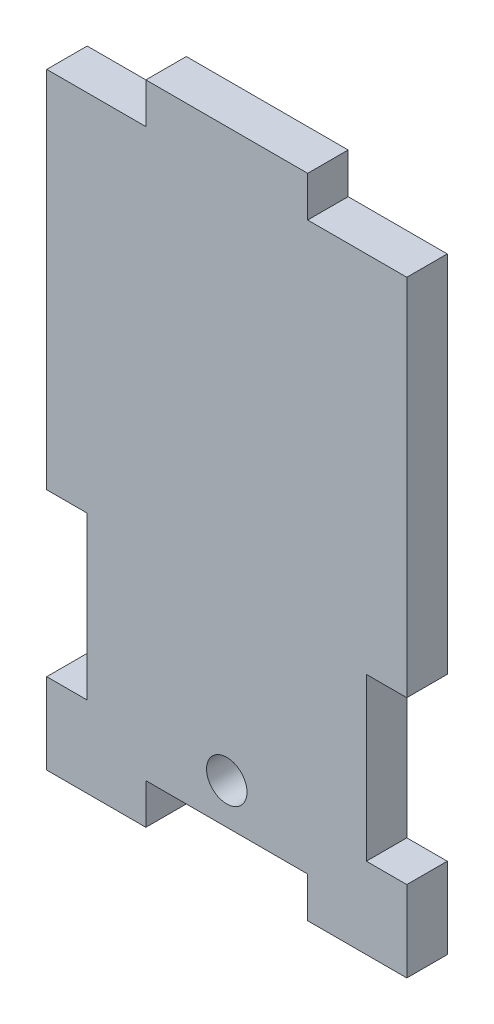
ISO-10303-21;
HEADER;
FILE_DESCRIPTION(('STEP AP214'),'2;1');
FILE_NAME('part.step','',(''),(''),'','','');
FILE_SCHEMA(('AUTOMOTIVE_DESIGN { 1 0 10303 214 1 1 1 1 }'));
ENDSEC;
DATA;
#1=APPLICATION_CONTEXT('core data for automotive mechanical design processes');
#2=APPLICATION_PROTOCOL_DEFINITION('international standard','automotive_design',2000,#1);
#3=PRODUCT_CONTEXT('',#1,'mechanical');
#4=PRODUCT('Part','Part','',(#3));
#5=PRODUCT_RELATED_PRODUCT_CATEGORY('part','',(#4));
#6=PRODUCT_DEFINITION_FORMATION('','',#4);
#7=PRODUCT_DEFINITION_CONTEXT('part definition',#1,'design');
#8=PRODUCT_DEFINITION('design','',#6,#7);
#9=PRODUCT_DEFINITION_SHAPE('','',#8);
#10=(LENGTH_UNIT() NAMED_UNIT(*) SI_UNIT(.MILLI.,.METRE.));
#11=(NAMED_UNIT(*) PLANE_ANGLE_UNIT() SI_UNIT($,.RADIAN.));
#12=(NAMED_UNIT(*) SI_UNIT($,.STERADIAN.) SOLID_ANGLE_UNIT());
#13=UNCERTAINTY_MEASURE_WITH_UNIT(LENGTH_MEASURE(1.E-05),#10,'distance_accuracy_value','');
#14=(GEOMETRIC_REPRESENTATION_CONTEXT(3) GLOBAL_UNCERTAINTY_ASSIGNED_CONTEXT((#13)) GLOBAL_UNIT_ASSIGNED_CONTEXT((#10,
#11,#12)) REPRESENTATION_CONTEXT('',''));
#15=CARTESIAN_POINT('',(0.,0.,0.));
#16=DIRECTION('',(0.,0.,1.));
#17=DIRECTION('',(1.,0.,0.));
#18=AXIS2_PLACEMENT_3D('',#15,#16,#17);
#19=CARTESIAN_POINT('',(0.,75.,5.));
#20=DIRECTION('',(0.,-1.,0.));
#21=DIRECTION('',(0.,0.,-1.));
#22=AXIS2_PLACEMENT_3D('',#19,#20,#21);
#23=PLANE('',#22);
#24=DIRECTION('',(-1.,0.,0.));
#25=VECTOR('',#24,1.);
#26=CARTESIAN_POINT('',(0.,75.,0.));
#27=LINE('',#26,#25);
#28=CARTESIAN_POINT('',(44.5,75.,0.));
#29=VERTEX_POINT('',#28);
#30=CARTESIAN_POINT('',(32.25,75.,0.));
#31=VERTEX_POINT('',#30);
#32=EDGE_CURVE('E208',#29,#31,#27,.T.);
#33=ORIENTED_EDGE('',*,*,#32,.T.);
#34=DIRECTION('',(0.,0.,-1.));
#35=VECTOR('',#34,1.);
#36=CARTESIAN_POINT('',(32.25,75.,5.));
#37=LINE('',#36,#35);
#38=CARTESIAN_POINT('',(32.25,75.,5.));
#39=VERTEX_POINT('',#38);
#40=EDGE_CURVE('E11',#39,#31,#37,.T.);
#41=ORIENTED_EDGE('',*,*,#40,.F.);
#42=DIRECTION('',(-1.,0.,0.));
#43=VECTOR('',#42,1.);
#44=CARTESIAN_POINT('',(0.,75.,5.));
#45=LINE('',#44,#43);
#46=CARTESIAN_POINT('',(44.5,75.,5.));
#47=VERTEX_POINT('',#46);
#48=EDGE_CURVE('E311',#47,#39,#45,.T.);
#49=ORIENTED_EDGE('',*,*,#48,.F.);
#50=DIRECTION('',(0.,0.,-1.));
#51=VECTOR('',#50,1.);
#52=CARTESIAN_POINT('',(44.5,75.,5.));
#53=LINE('',#52,#51);
#54=EDGE_CURVE('E200',#47,#29,#53,.T.);
#55=ORIENTED_EDGE('',*,*,#54,.T.);
#56=EDGE_LOOP('',(#33,#41,#49,#55));
#57=FACE_BOUND('',#56,.T.);
#58=ADVANCED_FACE('F36',(#57),#23,.F.);
#59=CARTESIAN_POINT('',(32.25,0.,5.));
#60=DIRECTION('',(-1.,0.,0.));
#61=DIRECTION('',(0.,0.,1.));
#62=AXIS2_PLACEMENT_3D('',#59,#60,#61);
#63=PLANE('',#62);
#64=DIRECTION('',(0.,1.,0.));
#65=VECTOR('',#64,1.);
#66=CARTESIAN_POINT('',(32.25,0.,0.));
#67=LINE('',#66,#65);
#68=CARTESIAN_POINT('',(32.25,80.,0.));
#69=VERTEX_POINT('',#68);
#70=EDGE_CURVE('E211',#31,#69,#67,.T.);
#71=ORIENTED_EDGE('',*,*,#70,.T.);
#72=DIRECTION('',(0.,0.,-1.));
#73=VECTOR('',#72,1.);
#74=CARTESIAN_POINT('',(32.25,80.,5.));
#75=LINE('',#74,#73);
#76=CARTESIAN_POINT('',(32.25,80.,5.));
#77=VERTEX_POINT('',#76);
#78=EDGE_CURVE('E45',#77,#69,#75,.T.);
#79=ORIENTED_EDGE('',*,*,#78,.F.);
#80=DIRECTION('',(0.,1.,0.));
#81=VECTOR('',#80,1.);
#82=CARTESIAN_POINT('',(32.25,0.,5.));
#83=LINE('',#82,#81);
#84=EDGE_CURVE('E128',#39,#77,#83,.T.);
#85=ORIENTED_EDGE('',*,*,#84,.F.);
#86=ORIENTED_EDGE('',*,*,#40,.T.);
#87=EDGE_LOOP('',(#71,#79,#85,#86));
#88=FACE_BOUND('',#87,.T.);
#89=ADVANCED_FACE('F294',(#88),#63,.F.);
#90=CARTESIAN_POINT('',(0.,80.,5.));
#91=DIRECTION('',(0.,1.,0.));
#92=DIRECTION('',(-1.,0.,0.));
#93=AXIS2_PLACEMENT_3D('',#90,#91,#92);
#94=PLANE('',#93);
#95=DIRECTION('',(1.,0.,0.));
#96=VECTOR('',#95,1.);
#97=CARTESIAN_POINT('',(0.,80.,0.));
#98=LINE('',#97,#96);
#99=CARTESIAN_POINT('',(12.25,80.,0.));
#100=VERTEX_POINT('',#99);
#101=EDGE_CURVE('E214',#100,#69,#98,.T.);
#102=ORIENTED_EDGE('',*,*,#101,.F.);
#103=DIRECTION('',(0.,0.,-1.));
#104=VECTOR('',#103,1.);
#105=CARTESIAN_POINT('',(12.25,80.,5.));
#106=LINE('',#105,#104);
#107=CARTESIAN_POINT('',(12.25,80.,5.));
#108=VERTEX_POINT('',#107);
#109=EDGE_CURVE('E287',#108,#100,#106,.T.);
#110=ORIENTED_EDGE('',*,*,#109,.F.);
#111=DIRECTION('',(1.,0.,0.));
#112=VECTOR('',#111,1.);
#113=CARTESIAN_POINT('',(0.,80.,5.));
#114=LINE('',#113,#112);
#115=EDGE_CURVE('E293',#108,#77,#114,.T.);
#116=ORIENTED_EDGE('',*,*,#115,.T.);
#117=ORIENTED_EDGE('',*,*,#78,.T.);
#118=EDGE_LOOP('',(#102,#110,#116,#117));
#119=FACE_BOUND('',#118,.T.);
#120=ADVANCED_FACE('F291',(#119),#94,.T.);
#121=CARTESIAN_POINT('',(12.25,0.,5.));
#122=DIRECTION('',(-1.,0.,0.));
#123=DIRECTION('',(0.,0.,1.));
#124=AXIS2_PLACEMENT_3D('',#121,#122,#123);
#125=PLANE('',#124);
#126=DIRECTION('',(0.,1.,0.));
#127=VECTOR('',#126,1.);
#128=CARTESIAN_POINT('',(12.25,0.,0.));
#129=LINE('',#128,#127);
#130=CARTESIAN_POINT('',(12.25,75.,0.));
#131=VERTEX_POINT('',#130);
#132=EDGE_CURVE('E217',#131,#100,#129,.T.);
#133=ORIENTED_EDGE('',*,*,#132,.F.);
#134=DIRECTION('',(0.,0.,-1.));
#135=VECTOR('',#134,1.);
#136=CARTESIAN_POINT('',(12.25,75.,5.));
#137=LINE('',#136,#135);
#138=CARTESIAN_POINT('',(12.25,75.,5.));
#139=VERTEX_POINT('',#138);
#140=EDGE_CURVE('E285',#139,#131,#137,.T.);
#141=ORIENTED_EDGE('',*,*,#140,.F.);
#142=DIRECTION('',(0.,1.,0.));
#143=VECTOR('',#142,1.);
#144=CARTESIAN_POINT('',(12.25,0.,5.));
#145=LINE('',#144,#143);
#146=EDGE_CURVE('E305',#139,#108,#145,.T.);
#147=ORIENTED_EDGE('',*,*,#146,.T.);
#148=ORIENTED_EDGE('',*,*,#109,.T.);
#149=EDGE_LOOP('',(#133,#141,#147,#148));
#150=FACE_BOUND('',#149,.T.);
#151=ADVANCED_FACE('F302',(#150),#125,.T.);
#152=CARTESIAN_POINT('',(0.,75.,5.));
#153=DIRECTION('',(0.,1.,0.));
#154=DIRECTION('',(0.,0.,1.));
#155=AXIS2_PLACEMENT_3D('',#152,#153,#154);
#156=PLANE('',#155);
#157=DIRECTION('',(1.,0.,0.));
#158=VECTOR('',#157,1.);
#159=CARTESIAN_POINT('',(0.,75.,0.));
#160=LINE('',#159,#158);
#161=CARTESIAN_POINT('',(0.,75.,0.));
#162=VERTEX_POINT('',#161);
#163=EDGE_CURVE('E220',#162,#131,#160,.T.);
#164=ORIENTED_EDGE('',*,*,#163,.F.);
#165=DIRECTION('',(0.,0.,-1.));
#166=VECTOR('',#165,1.);
#167=CARTESIAN_POINT('',(0.,75.,5.));
#168=LINE('',#167,#166);
#169=CARTESIAN_POINT('',(0.,75.,5.));
#170=VERTEX_POINT('',#169);
#171=EDGE_CURVE('E283',#170,#162,#168,.T.);
#172=ORIENTED_EDGE('',*,*,#171,.F.);
#173=DIRECTION('',(1.,0.,0.));
#174=VECTOR('',#173,1.);
#175=CARTESIAN_POINT('',(0.,75.,5.));
#176=LINE('',#175,#174);
#177=EDGE_CURVE('E309',#170,#139,#176,.T.);
#178=ORIENTED_EDGE('',*,*,#177,.T.);
#179=ORIENTED_EDGE('',*,*,#140,.T.);
#180=EDGE_LOOP('',(#164,#172,#178,#179));
#181=FACE_BOUND('',#180,.T.);
#182=ADVANCED_FACE('F380',(#181),#156,.T.);
#183=CARTESIAN_POINT('',(0.,0.,5.));
#184=DIRECTION('',(-1.,0.,0.));
#185=DIRECTION('',(0.,0.,1.));
#186=AXIS2_PLACEMENT_3D('',#183,#184,#185);
#187=PLANE('',#186);
#188=DIRECTION('',(0.,1.,0.));
#189=VECTOR('',#188,1.);
#190=CARTESIAN_POINT('',(0.,0.,0.));
#191=LINE('',#190,#189);
#192=CARTESIAN_POINT('',(0.,30.,0.));
#193=VERTEX_POINT('',#192);
#194=EDGE_CURVE('E223',#193,#162,#191,.T.);
#195=ORIENTED_EDGE('',*,*,#194,.F.);
#196=DIRECTION('',(0.,0.,-1.));
#197=VECTOR('',#196,1.);
#198=CARTESIAN_POINT('',(0.,30.,5.));
#199=LINE('',#198,#197);
#200=CARTESIAN_POINT('',(0.,30.,5.));
#201=VERTEX_POINT('',#200);
#202=EDGE_CURVE('E281',#201,#193,#199,.T.);
#203=ORIENTED_EDGE('',*,*,#202,.F.);
#204=DIRECTION('',(0.,1.,0.));
#205=VECTOR('',#204,1.);
#206=CARTESIAN_POINT('',(0.,0.,5.));
#207=LINE('',#206,#205);
#208=EDGE_CURVE('E316',#201,#170,#207,.T.);
#209=ORIENTED_EDGE('',*,*,#208,.T.);
#210=ORIENTED_EDGE('',*,*,#171,.T.);
#211=EDGE_LOOP('',(#195,#203,#209,#210));
#212=FACE_BOUND('',#211,.T.);
#213=ADVANCED_FACE('F383',(#212),#187,.T.);
#214=CARTESIAN_POINT('',(0.,30.,5.));
#215=DIRECTION('',(0.,1.,0.));
#216=DIRECTION('',(0.,0.,1.));
#217=AXIS2_PLACEMENT_3D('',#214,#215,#216);
#218=PLANE('',#217);
#219=DIRECTION('',(1.,0.,0.));
#220=VECTOR('',#219,1.);
#221=CARTESIAN_POINT('',(0.,30.,0.));
#222=LINE('',#221,#220);
#223=CARTESIAN_POINT('',(5.,30.,0.));
#224=VERTEX_POINT('',#223);
#225=EDGE_CURVE('E226',#193,#224,#222,.T.);
#226=ORIENTED_EDGE('',*,*,#225,.T.);
#227=DIRECTION('',(0.,0.,-1.));
#228=VECTOR('',#227,1.);
#229=CARTESIAN_POINT('',(5.,30.,5.));
#230=LINE('',#229,#228);
#231=CARTESIAN_POINT('',(5.,30.,5.));
#232=VERTEX_POINT('',#231);
#233=EDGE_CURVE('E279',#232,#224,#230,.T.);
#234=ORIENTED_EDGE('',*,*,#233,.F.);
#235=DIRECTION('',(1.,0.,0.));
#236=VECTOR('',#235,1.);
#237=CARTESIAN_POINT('',(0.,30.,5.));
#238=LINE('',#237,#236);
#239=EDGE_CURVE('E319',#201,#232,#238,.T.);
#240=ORIENTED_EDGE('',*,*,#239,.F.);
#241=ORIENTED_EDGE('',*,*,#202,.T.);
#242=EDGE_LOOP('',(#226,#234,#240,#241));
#243=FACE_BOUND('',#242,.T.);
#244=ADVANCED_FACE('F385',(#243),#218,.F.);
#245=CARTESIAN_POINT('',(5.,0.,5.));
#246=DIRECTION('',(-1.,0.,0.));
#247=DIRECTION('',(0.,0.,1.));
#248=AXIS2_PLACEMENT_3D('',#245,#246,#247);
#249=PLANE('',#248);
#250=DIRECTION('',(0.,1.,0.));
#251=VECTOR('',#250,1.);
#252=CARTESIAN_POINT('',(5.,0.,0.));
#253=LINE('',#252,#251);
#254=CARTESIAN_POINT('',(5.,10.,0.));
#255=VERTEX_POINT('',#254);
#256=EDGE_CURVE('E230',#255,#224,#253,.T.);
#257=ORIENTED_EDGE('',*,*,#256,.F.);
#258=DIRECTION('',(0.,0.,-1.));
#259=VECTOR('',#258,1.);
#260=CARTESIAN_POINT('',(5.,10.,5.));
#261=LINE('',#260,#259);
#262=CARTESIAN_POINT('',(5.,10.,5.));
#263=VERTEX_POINT('',#262);
#264=EDGE_CURVE('E277',#263,#255,#261,.T.);
#265=ORIENTED_EDGE('',*,*,#264,.F.);
#266=DIRECTION('',(0.,1.,0.));
#267=VECTOR('',#266,1.);
#268=CARTESIAN_POINT('',(5.,0.,5.));
#269=LINE('',#268,#267);
#270=EDGE_CURVE('E322',#263,#232,#269,.T.);
#271=ORIENTED_EDGE('',*,*,#270,.T.);
#272=ORIENTED_EDGE('',*,*,#233,.T.);
#273=EDGE_LOOP('',(#257,#265,#271,#272));
#274=FACE_BOUND('',#273,.T.);
#275=ADVANCED_FACE('F388',(#274),#249,.T.);
#276=CARTESIAN_POINT('',(0.,10.,5.));
#277=DIRECTION('',(0.,1.,0.));
#278=DIRECTION('',(0.,0.,1.));
#279=AXIS2_PLACEMENT_3D('',#276,#277,#278);
#280=PLANE('',#279);
#281=DIRECTION('',(1.,0.,0.));
#282=VECTOR('',#281,1.);
#283=CARTESIAN_POINT('',(0.,10.,0.));
#284=LINE('',#283,#282);
#285=CARTESIAN_POINT('',(0.,10.,0.));
#286=VERTEX_POINT('',#285);
#287=EDGE_CURVE('E233',#286,#255,#284,.T.);
#288=ORIENTED_EDGE('',*,*,#287,.F.);
#289=DIRECTION('',(0.,0.,-1.));
#290=VECTOR('',#289,1.);
#291=CARTESIAN_POINT('',(0.,10.,5.));
#292=LINE('',#291,#290);
#293=CARTESIAN_POINT('',(0.,10.,5.));
#294=VERTEX_POINT('',#293);
#295=EDGE_CURVE('E275',#294,#286,#292,.T.);
#296=ORIENTED_EDGE('',*,*,#295,.F.);
#297=DIRECTION('',(1.,0.,0.));
#298=VECTOR('',#297,1.);
#299=CARTESIAN_POINT('',(0.,10.,5.));
#300=LINE('',#299,#298);
#301=EDGE_CURVE('E325',#294,#263,#300,.T.);
#302=ORIENTED_EDGE('',*,*,#301,.T.);
#303=ORIENTED_EDGE('',*,*,#264,.T.);
#304=EDGE_LOOP('',(#288,#296,#302,#303));
#305=FACE_BOUND('',#304,.T.);
#306=ADVANCED_FACE('F392',(#305),#280,.T.);
#307=CARTESIAN_POINT('',(0.,0.,0.));
#308=VERTEX_POINT('',#307);
#309=EDGE_CURVE('E227',#308,#286,#191,.T.);
#310=ORIENTED_EDGE('',*,*,#309,.F.);
#311=DIRECTION('',(0.,0.,-1.));
#312=VECTOR('',#311,1.);
#313=CARTESIAN_POINT('',(0.,0.,5.));
#314=LINE('',#313,#312);
#315=CARTESIAN_POINT('',(0.,0.,5.));
#316=VERTEX_POINT('',#315);
#317=EDGE_CURVE('E273',#316,#308,#314,.T.);
#318=ORIENTED_EDGE('',*,*,#317,.F.);
#319=EDGE_CURVE('E320',#316,#294,#207,.T.);
#320=ORIENTED_EDGE('',*,*,#319,.T.);
#321=ORIENTED_EDGE('',*,*,#295,.T.);
#322=EDGE_LOOP('',(#310,#318,#320,#321));
#323=FACE_BOUND('',#322,.T.);
#324=ADVANCED_FACE('F396',(#323),#187,.T.);
#325=CARTESIAN_POINT('',(0.,0.,5.));
#326=DIRECTION('',(0.,1.,0.));
#327=DIRECTION('',(0.,0.,1.));
#328=AXIS2_PLACEMENT_3D('',#325,#326,#327);
#329=PLANE('',#328);
#330=DIRECTION('',(1.,0.,0.));
#331=VECTOR('',#330,1.);
#332=CARTESIAN_POINT('',(0.,0.,0.));
#333=LINE('',#332,#331);
#334=CARTESIAN_POINT('',(12.25,0.,0.));
#335=VERTEX_POINT('',#334);
#336=EDGE_CURVE('E236',#308,#335,#333,.T.);
#337=ORIENTED_EDGE('',*,*,#336,.T.);
#338=DIRECTION('',(0.,0.,-1.));
#339=VECTOR('',#338,1.);
#340=CARTESIAN_POINT('',(12.25,0.,5.));
#341=LINE('',#340,#339);
#342=CARTESIAN_POINT('',(12.25,0.,5.));
#343=VERTEX_POINT('',#342);
#344=EDGE_CURVE('E270',#343,#335,#341,.T.);
#345=ORIENTED_EDGE('',*,*,#344,.F.);
#346=DIRECTION('',(1.,0.,0.));
#347=VECTOR('',#346,1.);
#348=CARTESIAN_POINT('',(0.,0.,5.));
#349=LINE('',#348,#347);
#350=EDGE_CURVE('E328',#316,#343,#349,.T.);
#351=ORIENTED_EDGE('',*,*,#350,.F.);
#352=ORIENTED_EDGE('',*,*,#317,.T.);
#353=EDGE_LOOP('',(#337,#345,#351,#352));
#354=FACE_BOUND('',#353,.T.);
#355=ADVANCED_FACE('F400',(#354),#329,.F.);
#356=CARTESIAN_POINT('',(12.25,0.,5.));
#357=DIRECTION('',(-1.,0.,0.));
#358=DIRECTION('',(0.,0.,1.));
#359=AXIS2_PLACEMENT_3D('',#356,#357,#358);
#360=PLANE('',#359);
#361=DIRECTION('',(0.,1.,0.));
#362=VECTOR('',#361,1.);
#363=CARTESIAN_POINT('',(12.25,0.,0.));
#364=LINE('',#363,#362);
#365=CARTESIAN_POINT('',(12.25,5.,0.));
#366=VERTEX_POINT('',#365);
#367=EDGE_CURVE('E238',#335,#366,#364,.T.);
#368=ORIENTED_EDGE('',*,*,#367,.T.);
#369=DIRECTION('',(0.,0.,-1.));
#370=VECTOR('',#369,1.);
#371=CARTESIAN_POINT('',(12.25,5.,5.));
#372=LINE('',#371,#370);
#373=CARTESIAN_POINT('',(12.25,5.,5.));
#374=VERTEX_POINT('',#373);
#375=EDGE_CURVE('E267',#374,#366,#372,.T.);
#376=ORIENTED_EDGE('',*,*,#375,.F.);
#377=DIRECTION('',(0.,1.,0.));
#378=VECTOR('',#377,1.);
#379=CARTESIAN_POINT('',(12.25,0.,5.));
#380=LINE('',#379,#378);
#381=EDGE_CURVE('E330',#343,#374,#380,.T.);
#382=ORIENTED_EDGE('',*,*,#381,.F.);
#383=ORIENTED_EDGE('',*,*,#344,.T.);
#384=EDGE_LOOP('',(#368,#376,#382,#383));
#385=FACE_BOUND('',#384,.T.);
#386=ADVANCED_FACE('F402',(#385),#360,.F.);
#387=CARTESIAN_POINT('',(0.,5.,5.));
#388=DIRECTION('',(0.,1.,0.));
#389=DIRECTION('',(-1.,0.,0.));
#390=AXIS2_PLACEMENT_3D('',#387,#388,#389);
#391=PLANE('',#390);
#392=DIRECTION('',(1.,0.,0.));
#393=VECTOR('',#392,1.);
#394=CARTESIAN_POINT('',(0.,5.,0.));
#395=LINE('',#394,#393);
#396=CARTESIAN_POINT('',(32.25,5.,0.));
#397=VERTEX_POINT('',#396);
#398=EDGE_CURVE('E241',#366,#397,#395,.T.);
#399=ORIENTED_EDGE('',*,*,#398,.T.);
#400=DIRECTION('',(0.,0.,-1.));
#401=VECTOR('',#400,1.);
#402=CARTESIAN_POINT('',(32.25,5.,5.));
#403=LINE('',#402,#401);
#404=CARTESIAN_POINT('',(32.25,5.,5.));
#405=VERTEX_POINT('',#404);
#406=EDGE_CURVE('E265',#405,#397,#403,.T.);
#407=ORIENTED_EDGE('',*,*,#406,.F.);
#408=DIRECTION('',(1.,0.,0.));
#409=VECTOR('',#408,1.);
#410=CARTESIAN_POINT('',(0.,5.,5.));
#411=LINE('',#410,#409);
#412=EDGE_CURVE('E333',#374,#405,#411,.T.);
#413=ORIENTED_EDGE('',*,*,#412,.F.);
#414=ORIENTED_EDGE('',*,*,#375,.T.);
#415=EDGE_LOOP('',(#399,#407,#413,#414));
#416=FACE_BOUND('',#415,.T.);
#417=ADVANCED_FACE('F405',(#416),#391,.F.);
#418=CARTESIAN_POINT('',(32.25,0.,5.));
#419=DIRECTION('',(-1.,0.,0.));
#420=DIRECTION('',(0.,0.,1.));
#421=AXIS2_PLACEMENT_3D('',#418,#419,#420);
#422=PLANE('',#421);
#423=DIRECTION('',(0.,1.,0.));
#424=VECTOR('',#423,1.);
#425=CARTESIAN_POINT('',(32.25,0.,0.));
#426=LINE('',#425,#424);
#427=CARTESIAN_POINT('',(32.25,0.,0.));
#428=VERTEX_POINT('',#427);
#429=EDGE_CURVE('E244',#428,#397,#426,.T.);
#430=ORIENTED_EDGE('',*,*,#429,.F.);
#431=DIRECTION('',(0.,0.,-1.));
#432=VECTOR('',#431,1.);
#433=CARTESIAN_POINT('',(32.25,0.,5.));
#434=LINE('',#433,#432);
#435=CARTESIAN_POINT('',(32.25,0.,5.));
#436=VERTEX_POINT('',#435);
#437=EDGE_CURVE('E263',#436,#428,#434,.T.);
#438=ORIENTED_EDGE('',*,*,#437,.F.);
#439=DIRECTION('',(0.,1.,0.));
#440=VECTOR('',#439,1.);
#441=CARTESIAN_POINT('',(32.25,0.,5.));
#442=LINE('',#441,#440);
#443=EDGE_CURVE('E335',#436,#405,#442,.T.);
#444=ORIENTED_EDGE('',*,*,#443,.T.);
#445=ORIENTED_EDGE('',*,*,#406,.T.);
#446=EDGE_LOOP('',(#430,#438,#444,#445));
#447=FACE_BOUND('',#446,.T.);
#448=ADVANCED_FACE('F409',(#447),#422,.T.);
#449=CARTESIAN_POINT('',(44.5,0.,0.));
#450=VERTEX_POINT('',#449);
#451=EDGE_CURVE('E239',#428,#450,#333,.T.);
#452=ORIENTED_EDGE('',*,*,#451,.T.);
#453=DIRECTION('',(0.,0.,-1.));
#454=VECTOR('',#453,1.);
#455=CARTESIAN_POINT('',(44.5,0.,5.));
#456=LINE('',#455,#454);
#457=CARTESIAN_POINT('',(44.5,0.,5.));
#458=VERTEX_POINT('',#457);
#459=EDGE_CURVE('E260',#458,#450,#456,.T.);
#460=ORIENTED_EDGE('',*,*,#459,.F.);
#461=EDGE_CURVE('E331',#436,#458,#349,.T.);
#462=ORIENTED_EDGE('',*,*,#461,.F.);
#463=ORIENTED_EDGE('',*,*,#437,.T.);
#464=EDGE_LOOP('',(#452,#460,#462,#463));
#465=FACE_BOUND('',#464,.T.);
#466=ADVANCED_FACE('F343',(#465),#329,.F.);
#467=CARTESIAN_POINT('',(44.5,0.,5.));
#468=DIRECTION('',(-1.,0.,0.));
#469=DIRECTION('',(0.,0.,1.));
#470=AXIS2_PLACEMENT_3D('',#467,#468,#469);
#471=PLANE('',#470);
#472=DIRECTION('',(0.,1.,0.));
#473=VECTOR('',#472,1.);
#474=CARTESIAN_POINT('',(44.5,0.,0.));
#475=LINE('',#474,#473);
#476=CARTESIAN_POINT('',(44.5,10.,0.));
#477=VERTEX_POINT('',#476);
#478=EDGE_CURVE('E247',#450,#477,#475,.T.);
#479=ORIENTED_EDGE('',*,*,#478,.T.);
#480=DIRECTION('',(0.,0.,-1.));
#481=VECTOR('',#480,1.);
#482=CARTESIAN_POINT('',(44.5,10.,5.));
#483=LINE('',#482,#481);
#484=CARTESIAN_POINT('',(44.5,10.,5.));
#485=VERTEX_POINT('',#484);
#486=EDGE_CURVE('E257',#485,#477,#483,.T.);
#487=ORIENTED_EDGE('',*,*,#486,.F.);
#488=DIRECTION('',(0.,1.,0.));
#489=VECTOR('',#488,1.);
#490=CARTESIAN_POINT('',(44.5,0.,5.));
#491=LINE('',#490,#489);
#492=EDGE_CURVE('E202',#458,#485,#491,.T.);
#493=ORIENTED_EDGE('',*,*,#492,.F.);
#494=ORIENTED_EDGE('',*,*,#459,.T.);
#495=EDGE_LOOP('',(#479,#487,#493,#494));
#496=FACE_BOUND('',#495,.T.);
#497=ADVANCED_FACE('F347',(#496),#471,.F.);
#498=CARTESIAN_POINT('',(0.,10.,5.));
#499=DIRECTION('',(0.,-1.,0.));
#500=DIRECTION('',(1.,0.,0.));
#501=AXIS2_PLACEMENT_3D('',#498,#499,#500);
#502=PLANE('',#501);
#503=DIRECTION('',(-1.,0.,0.));
#504=VECTOR('',#503,1.);
#505=CARTESIAN_POINT('',(0.,10.,0.));
#506=LINE('',#505,#504);
#507=CARTESIAN_POINT('',(39.5,10.,0.));
#508=VERTEX_POINT('',#507);
#509=EDGE_CURVE('E249',#477,#508,#506,.T.);
#510=ORIENTED_EDGE('',*,*,#509,.T.);
#511=DIRECTION('',(0.,0.,-1.));
#512=VECTOR('',#511,1.);
#513=CARTESIAN_POINT('',(39.5,10.,5.));
#514=LINE('',#513,#512);
#515=CARTESIAN_POINT('',(39.5,10.,5.));
#516=VERTEX_POINT('',#515);
#517=EDGE_CURVE('E196',#516,#508,#514,.T.);
#518=ORIENTED_EDGE('',*,*,#517,.F.);
#519=DIRECTION('',(-1.,0.,0.));
#520=VECTOR('',#519,1.);
#521=CARTESIAN_POINT('',(0.,10.,5.));
#522=LINE('',#521,#520);
#523=EDGE_CURVE('E183',#485,#516,#522,.T.);
#524=ORIENTED_EDGE('',*,*,#523,.F.);
#525=ORIENTED_EDGE('',*,*,#486,.T.);
#526=EDGE_LOOP('',(#510,#518,#524,#525));
#527=FACE_BOUND('',#526,.T.);
#528=ADVANCED_FACE('F350',(#527),#502,.F.);
#529=CARTESIAN_POINT('',(39.5,0.,5.));
#530=DIRECTION('',(-1.,0.,0.));
#531=DIRECTION('',(0.,0.,1.));
#532=AXIS2_PLACEMENT_3D('',#529,#530,#531);
#533=PLANE('',#532);
#534=DIRECTION('',(0.,1.,0.));
#535=VECTOR('',#534,1.);
#536=CARTESIAN_POINT('',(39.5,0.,0.));
#537=LINE('',#536,#535);
#538=CARTESIAN_POINT('',(39.5,30.,0.));
#539=VERTEX_POINT('',#538);
#540=EDGE_CURVE('E192',#508,#539,#537,.T.);
#541=ORIENTED_EDGE('',*,*,#540,.T.);
#542=DIRECTION('',(0.,0.,-1.));
#543=VECTOR('',#542,1.);
#544=CARTESIAN_POINT('',(39.5,30.,5.));
#545=LINE('',#544,#543);
#546=CARTESIAN_POINT('',(39.5,30.,5.));
#547=VERTEX_POINT('',#546);
#548=EDGE_CURVE('E189',#547,#539,#545,.T.);
#549=ORIENTED_EDGE('',*,*,#548,.F.);
#550=DIRECTION('',(0.,1.,0.));
#551=VECTOR('',#550,1.);
#552=CARTESIAN_POINT('',(39.5,0.,5.));
#553=LINE('',#552,#551);
#554=EDGE_CURVE('E177',#516,#547,#553,.T.);
#555=ORIENTED_EDGE('',*,*,#554,.F.);
#556=ORIENTED_EDGE('',*,*,#517,.T.);
#557=EDGE_LOOP('',(#541,#549,#555,#556));
#558=FACE_BOUND('',#557,.T.);
#559=ADVANCED_FACE('F190',(#558),#533,.F.);
#560=CARTESIAN_POINT('',(0.,30.,5.));
#561=DIRECTION('',(0.,-1.,0.));
#562=DIRECTION('',(0.,0.,-1.));
#563=AXIS2_PLACEMENT_3D('',#560,#561,#562);
#564=PLANE('',#563);
#565=DIRECTION('',(-1.,0.,0.));
#566=VECTOR('',#565,1.);
#567=CARTESIAN_POINT('',(0.,30.,0.));
#568=LINE('',#567,#566);
#569=CARTESIAN_POINT('',(44.5,30.,0.));
#570=VERTEX_POINT('',#569);
#571=EDGE_CURVE('E252',#570,#539,#568,.T.);
#572=ORIENTED_EDGE('',*,*,#571,.F.);
#573=DIRECTION('',(0.,0.,-1.));
#574=VECTOR('',#573,1.);
#575=CARTESIAN_POINT('',(44.5,30.,5.));
#576=LINE('',#575,#574);
#577=CARTESIAN_POINT('',(44.5,30.,5.));
#578=VERTEX_POINT('',#577);
#579=EDGE_CURVE('E117',#578,#570,#576,.T.);
#580=ORIENTED_EDGE('',*,*,#579,.F.);
#581=DIRECTION('',(-1.,0.,0.));
#582=VECTOR('',#581,1.);
#583=CARTESIAN_POINT('',(0.,30.,5.));
#584=LINE('',#583,#582);
#585=EDGE_CURVE('E181',#578,#547,#584,.T.);
#586=ORIENTED_EDGE('',*,*,#585,.T.);
#587=ORIENTED_EDGE('',*,*,#548,.T.);
#588=EDGE_LOOP('',(#572,#580,#586,#587));
#589=FACE_BOUND('',#588,.T.);
#590=ADVANCED_FACE('F198',(#589),#564,.T.);
#591=CARTESIAN_POINT('',(22.25,10.,5.));
#592=DIRECTION('',(0.,0.,-1.));
#593=DIRECTION('',(-1.,0.,0.));
#594=AXIS2_PLACEMENT_3D('',#591,#592,#593);
#595=CYLINDRICAL_SURFACE('',#594,2.5);
#596=CARTESIAN_POINT('',(22.25,10.,5.));
#597=DIRECTION('',(0.,0.,1.));
#598=DIRECTION('',(1.,0.,0.));
#599=AXIS2_PLACEMENT_3D('',#596,#597,#598);
#600=CIRCLE('',#599,2.5);
#601=CARTESIAN_POINT('',(24.75,10.,5.));
#602=VERTEX_POINT('',#601);
#603=EDGE_CURVE('E351',#602,#602,#600,.T.);
#604=ORIENTED_EDGE('',*,*,#603,.T.);
#605=EDGE_LOOP('',(#604));
#606=FACE_BOUND('',#605,.T.);
#607=CARTESIAN_POINT('',(22.25,10.,0.));
#608=DIRECTION('',(0.,0.,1.));
#609=DIRECTION('',(1.,0.,0.));
#610=AXIS2_PLACEMENT_3D('',#607,#608,#609);
#611=CIRCLE('',#610,2.5);
#612=CARTESIAN_POINT('',(24.75,10.,0.));
#613=VERTEX_POINT('',#612);
#614=EDGE_CURVE('E205',#613,#613,#611,.T.);
#615=ORIENTED_EDGE('',*,*,#614,.F.);
#616=EDGE_LOOP('',(#615));
#617=FACE_BOUND('',#616,.T.);
#618=ADVANCED_FACE('F38',(#606,#617),#595,.F.);
#619=EDGE_CURVE('E120',#570,#29,#475,.T.);
#620=ORIENTED_EDGE('',*,*,#619,.T.);
#621=ORIENTED_EDGE('',*,*,#54,.F.);
#622=EDGE_CURVE('E53',#578,#47,#491,.T.);
#623=ORIENTED_EDGE('',*,*,#622,.F.);
#624=ORIENTED_EDGE('',*,*,#579,.T.);
#625=EDGE_LOOP('',(#620,#621,#623,#624));
#626=FACE_BOUND('',#625,.T.);
#627=ADVANCED_FACE('F358',(#626),#471,.F.);
#628=CARTESIAN_POINT('',(0.,0.,5.));
#629=DIRECTION('',(0.,0.,1.));
#630=DIRECTION('',(1.,0.,0.));
#631=AXIS2_PLACEMENT_3D('',#628,#629,#630);
#632=PLANE('',#631);
#633=ORIENTED_EDGE('',*,*,#603,.F.);
#634=EDGE_LOOP('',(#633));
#635=FACE_BOUND('',#634,.T.);
#636=ORIENTED_EDGE('',*,*,#48,.T.);
#637=ORIENTED_EDGE('',*,*,#84,.T.);
#638=ORIENTED_EDGE('',*,*,#115,.F.);
#639=ORIENTED_EDGE('',*,*,#146,.F.);
#640=ORIENTED_EDGE('',*,*,#177,.F.);
#641=ORIENTED_EDGE('',*,*,#208,.F.);
#642=ORIENTED_EDGE('',*,*,#239,.T.);
#643=ORIENTED_EDGE('',*,*,#270,.F.);
#644=ORIENTED_EDGE('',*,*,#301,.F.);
#645=ORIENTED_EDGE('',*,*,#319,.F.);
#646=ORIENTED_EDGE('',*,*,#350,.T.);
#647=ORIENTED_EDGE('',*,*,#381,.T.);
#648=ORIENTED_EDGE('',*,*,#412,.T.);
#649=ORIENTED_EDGE('',*,*,#443,.F.);
#650=ORIENTED_EDGE('',*,*,#461,.T.);
#651=ORIENTED_EDGE('',*,*,#492,.T.);
#652=ORIENTED_EDGE('',*,*,#523,.T.);
#653=ORIENTED_EDGE('',*,*,#554,.T.);
#654=ORIENTED_EDGE('',*,*,#585,.F.);
#655=ORIENTED_EDGE('',*,*,#622,.T.);
#656=EDGE_LOOP('',(#636,#637,#638,#639,#640,#641,#642,#643,#644,#645,#646,#647,#648,#649,#650,
#651,#652,#653,#654,#655));
#657=FACE_BOUND('',#656,.T.);
#658=ADVANCED_FACE('F179',(#635,#657),#632,.T.);
#659=CARTESIAN_POINT('',(0.,0.,0.));
#660=DIRECTION('',(0.,0.,1.));
#661=DIRECTION('',(1.,0.,0.));
#662=AXIS2_PLACEMENT_3D('',#659,#660,#661);
#663=PLANE('',#662);
#664=ORIENTED_EDGE('',*,*,#614,.T.);
#665=EDGE_LOOP('',(#664));
#666=FACE_BOUND('',#665,.T.);
#667=ORIENTED_EDGE('',*,*,#32,.F.);
#668=ORIENTED_EDGE('',*,*,#619,.F.);
#669=ORIENTED_EDGE('',*,*,#571,.T.);
#670=ORIENTED_EDGE('',*,*,#540,.F.);
#671=ORIENTED_EDGE('',*,*,#509,.F.);
#672=ORIENTED_EDGE('',*,*,#478,.F.);
#673=ORIENTED_EDGE('',*,*,#451,.F.);
#674=ORIENTED_EDGE('',*,*,#429,.T.);
#675=ORIENTED_EDGE('',*,*,#398,.F.);
#676=ORIENTED_EDGE('',*,*,#367,.F.);
#677=ORIENTED_EDGE('',*,*,#336,.F.);
#678=ORIENTED_EDGE('',*,*,#309,.T.);
#679=ORIENTED_EDGE('',*,*,#287,.T.);
#680=ORIENTED_EDGE('',*,*,#256,.T.);
#681=ORIENTED_EDGE('',*,*,#225,.F.);
#682=ORIENTED_EDGE('',*,*,#194,.T.);
#683=ORIENTED_EDGE('',*,*,#163,.T.);
#684=ORIENTED_EDGE('',*,*,#132,.T.);
#685=ORIENTED_EDGE('',*,*,#101,.T.);
#686=ORIENTED_EDGE('',*,*,#70,.F.);
#687=EDGE_LOOP('',(#667,#668,#669,#670,#671,#672,#673,#674,#675,#676,#677,#678,#679,#680,#681,
#682,#683,#684,#685,#686));
#688=FACE_BOUND('',#687,.T.);
#689=ADVANCED_FACE('F298',(#666,#688),#663,.F.);
#690=CLOSED_SHELL('',(#58,#89,#120,#151,#182,#213,#244,#275,#306,#324,#355,#386,#417,#448,#466,
#497,#528,#559,#590,#618,#627,#658,#689));
#691=MANIFOLD_SOLID_BREP('B2',#690);
#692=ADVANCED_BREP_SHAPE_REPRESENTATION('',(#18,#691),#14);
#693=SHAPE_DEFINITION_REPRESENTATION(#9,#692);
ENDSEC;
END-ISO-10303-21;
